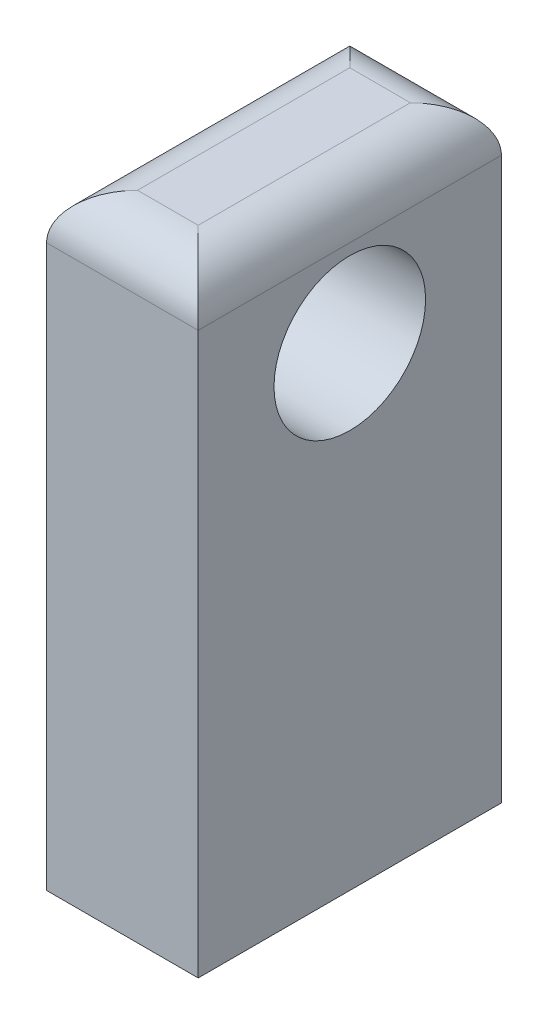
ISO-10303-21;
HEADER;
FILE_DESCRIPTION(('STEP AP214'),'2;1');
FILE_NAME('part.step','',(''),(''),'','','');
FILE_SCHEMA(('AUTOMOTIVE_DESIGN { 1 0 10303 214 1 1 1 1 }'));
ENDSEC;
DATA;
#1=APPLICATION_CONTEXT('core data for automotive mechanical design processes');
#2=APPLICATION_PROTOCOL_DEFINITION('international standard','automotive_design',2000,#1);
#3=PRODUCT_CONTEXT('',#1,'mechanical');
#4=PRODUCT('Part','Part','',(#3));
#5=PRODUCT_RELATED_PRODUCT_CATEGORY('part','',(#4));
#6=PRODUCT_DEFINITION_FORMATION('','',#4);
#7=PRODUCT_DEFINITION_CONTEXT('part definition',#1,'design');
#8=PRODUCT_DEFINITION('design','',#6,#7);
#9=PRODUCT_DEFINITION_SHAPE('','',#8);
#10=(LENGTH_UNIT() NAMED_UNIT(*) SI_UNIT(.MILLI.,.METRE.));
#11=(NAMED_UNIT(*) PLANE_ANGLE_UNIT() SI_UNIT($,.RADIAN.));
#12=(NAMED_UNIT(*) SI_UNIT($,.STERADIAN.) SOLID_ANGLE_UNIT());
#13=UNCERTAINTY_MEASURE_WITH_UNIT(LENGTH_MEASURE(1.E-05),#10,'distance_accuracy_value','');
#14=(GEOMETRIC_REPRESENTATION_CONTEXT(3) GLOBAL_UNCERTAINTY_ASSIGNED_CONTEXT((#13)) GLOBAL_UNIT_ASSIGNED_CONTEXT((#10,
#11,#12)) REPRESENTATION_CONTEXT('',''));
#15=CARTESIAN_POINT('',(0.,0.,0.));
#16=DIRECTION('',(0.,0.,1.));
#17=DIRECTION('',(1.,0.,0.));
#18=AXIS2_PLACEMENT_3D('',#15,#16,#17);
#19=CARTESIAN_POINT('',(10.,0.,-10.));
#20=DIRECTION('',(0.,0.,-1.));
#21=DIRECTION('',(0.,1.,0.));
#22=AXIS2_PLACEMENT_3D('',#19,#20,#21);
#23=PLANE('',#22);
#24=DIRECTION('',(0.,-1.,0.));
#25=VECTOR('',#24,1.);
#26=CARTESIAN_POINT('',(0.,0.,-10.));
#27=LINE('',#26,#25);
#28=CARTESIAN_POINT('',(0.,17.,-10.));
#29=VERTEX_POINT('',#28);
#30=CARTESIAN_POINT('',(0.,-20.,-10.));
#31=VERTEX_POINT('',#30);
#32=EDGE_CURVE('E144',#29,#31,#27,.T.);
#33=ORIENTED_EDGE('',*,*,#32,.F.);
#34=DIRECTION('',(-1.,0.,0.));
#35=VECTOR('',#34,1.);
#36=CARTESIAN_POINT('',(10.,17.,-10.));
#37=LINE('',#36,#35);
#38=CARTESIAN_POINT('',(10.,17.,-10.));
#39=VERTEX_POINT('',#38);
#40=EDGE_CURVE('E173',#29,#39,#37,.F.);
#41=ORIENTED_EDGE('',*,*,#40,.T.);
#42=DIRECTION('',(0.,-1.,0.));
#43=VECTOR('',#42,1.);
#44=CARTESIAN_POINT('',(10.,0.,-10.));
#45=LINE('',#44,#43);
#46=CARTESIAN_POINT('',(10.,-20.,-10.));
#47=VERTEX_POINT('',#46);
#48=EDGE_CURVE('E128',#39,#47,#45,.T.);
#49=ORIENTED_EDGE('',*,*,#48,.T.);
#50=DIRECTION('',(-1.,0.,0.));
#51=VECTOR('',#50,1.);
#52=CARTESIAN_POINT('',(10.,-20.,-10.));
#53=LINE('',#52,#51);
#54=EDGE_CURVE('E139',#47,#31,#53,.T.);
#55=ORIENTED_EDGE('',*,*,#54,.T.);
#56=EDGE_LOOP('',(#33,#41,#49,#55));
#57=FACE_BOUND('',#56,.T.);
#58=ADVANCED_FACE('F47',(#57),#23,.T.);
#59=CARTESIAN_POINT('',(10.,20.,0.));
#60=DIRECTION('',(0.,1.,0.));
#61=DIRECTION('',(0.,0.,1.));
#62=AXIS2_PLACEMENT_3D('',#59,#60,#61);
#63=PLANE('',#62);
#64=DIRECTION('',(0.,0.,-1.));
#65=VECTOR('',#64,1.);
#66=CARTESIAN_POINT('',(7.,20.,0.));
#67=LINE('',#66,#65);
#68=CARTESIAN_POINT('',(7.,20.,6.99999999999999));
#69=VERTEX_POINT('',#68);
#70=CARTESIAN_POINT('',(7.,20.,-7.));
#71=VERTEX_POINT('',#70);
#72=EDGE_CURVE('E166',#69,#71,#67,.T.);
#73=ORIENTED_EDGE('',*,*,#72,.T.);
#74=DIRECTION('',(-1.,0.,0.));
#75=VECTOR('',#74,1.);
#76=CARTESIAN_POINT('',(10.,20.,-7.));
#77=LINE('',#76,#75);
#78=CARTESIAN_POINT('',(3.,20.,-7.));
#79=VERTEX_POINT('',#78);
#80=EDGE_CURVE('E169',#71,#79,#77,.T.);
#81=ORIENTED_EDGE('',*,*,#80,.T.);
#82=DIRECTION('',(0.,0.,-1.));
#83=VECTOR('',#82,1.);
#84=CARTESIAN_POINT('',(3.,20.,9.99999999999999));
#85=LINE('',#84,#83);
#86=CARTESIAN_POINT('',(3.,20.,6.99999999999999));
#87=VERTEX_POINT('',#86);
#88=EDGE_CURVE('E160',#79,#87,#85,.F.);
#89=ORIENTED_EDGE('',*,*,#88,.T.);
#90=DIRECTION('',(-1.,0.,0.));
#91=VECTOR('',#90,1.);
#92=CARTESIAN_POINT('',(10.,20.,6.99999999999999));
#93=LINE('',#92,#91);
#94=EDGE_CURVE('E163',#87,#69,#93,.F.);
#95=ORIENTED_EDGE('',*,*,#94,.T.);
#96=EDGE_LOOP('',(#73,#81,#89,#95));
#97=FACE_BOUND('',#96,.T.);
#98=ADVANCED_FACE('F210',(#97),#63,.T.);
#99=CARTESIAN_POINT('',(10.,0.,9.99999999999999));
#100=DIRECTION('',(0.,0.,-1.));
#101=DIRECTION('',(0.,1.,0.));
#102=AXIS2_PLACEMENT_3D('',#99,#100,#101);
#103=PLANE('',#102);
#104=DIRECTION('',(0.,-1.,0.));
#105=VECTOR('',#104,1.);
#106=CARTESIAN_POINT('',(10.,0.,9.99999999999999));
#107=LINE('',#106,#105);
#108=CARTESIAN_POINT('',(10.,17.,9.99999999999999));
#109=VERTEX_POINT('',#108);
#110=CARTESIAN_POINT('',(10.,-20.,9.99999999999999));
#111=VERTEX_POINT('',#110);
#112=EDGE_CURVE('E132',#109,#111,#107,.T.);
#113=ORIENTED_EDGE('',*,*,#112,.F.);
#114=DIRECTION('',(-1.,0.,0.));
#115=VECTOR('',#114,1.);
#116=CARTESIAN_POINT('',(0.,17.,9.99999999999999));
#117=LINE('',#116,#115);
#118=CARTESIAN_POINT('',(0.,17.,9.99999999999999));
#119=VERTEX_POINT('',#118);
#120=EDGE_CURVE('E57',#109,#119,#117,.T.);
#121=ORIENTED_EDGE('',*,*,#120,.T.);
#122=DIRECTION('',(0.,-1.,0.));
#123=VECTOR('',#122,1.);
#124=CARTESIAN_POINT('',(0.,0.,9.99999999999999));
#125=LINE('',#124,#123);
#126=CARTESIAN_POINT('',(0.,-20.,9.99999999999999));
#127=VERTEX_POINT('',#126);
#128=EDGE_CURVE('E147',#119,#127,#125,.T.);
#129=ORIENTED_EDGE('',*,*,#128,.T.);
#130=DIRECTION('',(-1.,0.,0.));
#131=VECTOR('',#130,1.);
#132=CARTESIAN_POINT('',(10.,-20.,9.99999999999999));
#133=LINE('',#132,#131);
#134=EDGE_CURVE('E156',#111,#127,#133,.T.);
#135=ORIENTED_EDGE('',*,*,#134,.F.);
#136=EDGE_LOOP('',(#113,#121,#129,#135));
#137=FACE_BOUND('',#136,.T.);
#138=ADVANCED_FACE('F212',(#137),#103,.F.);
#139=CARTESIAN_POINT('',(10.,11.27,0.));
#140=DIRECTION('',(-1.,0.,0.));
#141=DIRECTION('',(0.,0.,1.));
#142=AXIS2_PLACEMENT_3D('',#139,#140,#141);
#143=CYLINDRICAL_SURFACE('',#142,5.);
#144=CARTESIAN_POINT('',(10.,11.27,0.));
#145=DIRECTION('',(1.,0.,0.));
#146=DIRECTION('',(0.,0.,-1.));
#147=AXIS2_PLACEMENT_3D('',#144,#145,#146);
#148=CIRCLE('',#147,5.);
#149=CARTESIAN_POINT('',(10.,11.27,-5.00000000000001));
#150=VERTEX_POINT('',#149);
#151=EDGE_CURVE('E124',#150,#150,#148,.T.);
#152=ORIENTED_EDGE('',*,*,#151,.T.);
#153=EDGE_LOOP('',(#152));
#154=FACE_BOUND('',#153,.T.);
#155=CARTESIAN_POINT('',(0.,11.27,0.));
#156=DIRECTION('',(1.,0.,0.));
#157=DIRECTION('',(0.,0.,-1.));
#158=AXIS2_PLACEMENT_3D('',#155,#156,#157);
#159=CIRCLE('',#158,5.);
#160=CARTESIAN_POINT('',(0.,11.27,-5.00000000000001));
#161=VERTEX_POINT('',#160);
#162=EDGE_CURVE('E140',#161,#161,#159,.T.);
#163=ORIENTED_EDGE('',*,*,#162,.F.);
#164=EDGE_LOOP('',(#163));
#165=FACE_BOUND('',#164,.T.);
#166=ADVANCED_FACE('F218',(#154,#165),#143,.F.);
#167=CARTESIAN_POINT('',(10.,-20.,0.));
#168=DIRECTION('',(0.,1.,0.));
#169=DIRECTION('',(0.,0.,1.));
#170=AXIS2_PLACEMENT_3D('',#167,#168,#169);
#171=PLANE('',#170);
#172=CARTESIAN_POINT('',(5.,-20.,0.));
#173=DIRECTION('',(0.,-1.,0.));
#174=DIRECTION('',(0.,0.,-1.));
#175=AXIS2_PLACEMENT_3D('',#172,#173,#174);
#176=CIRCLE('',#175,1.49999999999999);
#177=CARTESIAN_POINT('',(5.,-20.,-1.49999999999999));
#178=VERTEX_POINT('',#177);
#179=EDGE_CURVE('E115',#178,#178,#176,.T.);
#180=ORIENTED_EDGE('',*,*,#179,.F.);
#181=EDGE_LOOP('',(#180));
#182=FACE_BOUND('',#181,.T.);
#183=DIRECTION('',(0.,0.,-1.));
#184=VECTOR('',#183,1.);
#185=CARTESIAN_POINT('',(0.,-20.,0.));
#186=LINE('',#185,#184);
#187=EDGE_CURVE('E129',#127,#31,#186,.T.);
#188=ORIENTED_EDGE('',*,*,#187,.T.);
#189=ORIENTED_EDGE('',*,*,#54,.F.);
#190=DIRECTION('',(0.,0.,-1.));
#191=VECTOR('',#190,1.);
#192=CARTESIAN_POINT('',(10.,-20.,0.));
#193=LINE('',#192,#191);
#194=EDGE_CURVE('E135',#111,#47,#193,.T.);
#195=ORIENTED_EDGE('',*,*,#194,.F.);
#196=ORIENTED_EDGE('',*,*,#134,.T.);
#197=EDGE_LOOP('',(#188,#189,#195,#196));
#198=FACE_BOUND('',#197,.T.);
#199=ADVANCED_FACE('F225',(#182,#198),#171,.F.);
#200=CARTESIAN_POINT('',(10.,0.,0.));
#201=DIRECTION('',(1.,0.,0.));
#202=DIRECTION('',(0.,0.,-1.));
#203=AXIS2_PLACEMENT_3D('',#200,#201,#202);
#204=PLANE('',#203);
#205=ORIENTED_EDGE('',*,*,#151,.F.);
#206=EDGE_LOOP('',(#205));
#207=FACE_BOUND('',#206,.T.);
#208=ORIENTED_EDGE('',*,*,#48,.F.);
#209=DIRECTION('',(0.,0.,-1.));
#210=VECTOR('',#209,1.);
#211=CARTESIAN_POINT('',(10.,17.,0.));
#212=LINE('',#211,#210);
#213=EDGE_CURVE('E72',#39,#109,#212,.F.);
#214=ORIENTED_EDGE('',*,*,#213,.T.);
#215=ORIENTED_EDGE('',*,*,#112,.T.);
#216=ORIENTED_EDGE('',*,*,#194,.T.);
#217=EDGE_LOOP('',(#208,#214,#215,#216));
#218=FACE_BOUND('',#217,.T.);
#219=ADVANCED_FACE('F237',(#207,#218),#204,.T.);
#220=CARTESIAN_POINT('',(0.,0.,0.));
#221=DIRECTION('',(1.,0.,0.));
#222=DIRECTION('',(0.,0.,-1.));
#223=AXIS2_PLACEMENT_3D('',#220,#221,#222);
#224=PLANE('',#223);
#225=ORIENTED_EDGE('',*,*,#162,.T.);
#226=EDGE_LOOP('',(#225));
#227=FACE_BOUND('',#226,.T.);
#228=ORIENTED_EDGE('',*,*,#128,.F.);
#229=DIRECTION('',(0.,0.,-1.));
#230=VECTOR('',#229,1.);
#231=CARTESIAN_POINT('',(0.,17.,-10.));
#232=LINE('',#231,#230);
#233=EDGE_CURVE('E11',#119,#29,#232,.T.);
#234=ORIENTED_EDGE('',*,*,#233,.T.);
#235=ORIENTED_EDGE('',*,*,#32,.T.);
#236=ORIENTED_EDGE('',*,*,#187,.F.);
#237=EDGE_LOOP('',(#228,#234,#235,#236));
#238=FACE_BOUND('',#237,.T.);
#239=ADVANCED_FACE('F202',(#227,#238),#224,.F.);
#240=CARTESIAN_POINT('',(10.,17.,6.99999999999999));
#241=DIRECTION('',(1.,0.,0.));
#242=DIRECTION('',(0.,0.,-1.));
#243=AXIS2_PLACEMENT_3D('',#240,#241,#242);
#244=CYLINDRICAL_SURFACE('',#243,3.);
#245=CARTESIAN_POINT('',(3.,17.,6.99999999999999));
#246=DIRECTION('',(0.707106781186547,0.,0.707106781186547));
#247=DIRECTION('',(-0.707106781186547,0.,0.707106781186547));
#248=AXIS2_PLACEMENT_3D('',#245,#246,#247);
#249=ELLIPSE('',#248,4.24264068711928,3.);
#250=EDGE_CURVE('E182',#119,#87,#249,.F.);
#251=ORIENTED_EDGE('',*,*,#250,.F.);
#252=ORIENTED_EDGE('',*,*,#120,.F.);
#253=CARTESIAN_POINT('',(7.,17.,6.99999999999999));
#254=DIRECTION('',(0.707106781186547,0.,-0.707106781186547));
#255=DIRECTION('',(0.707106781186547,0.,0.707106781186547));
#256=AXIS2_PLACEMENT_3D('',#253,#254,#255);
#257=ELLIPSE('',#256,4.24264068711928,3.);
#258=EDGE_CURVE('E51',#69,#109,#257,.T.);
#259=ORIENTED_EDGE('',*,*,#258,.F.);
#260=ORIENTED_EDGE('',*,*,#94,.F.);
#261=EDGE_LOOP('',(#251,#252,#259,#260));
#262=FACE_BOUND('',#261,.T.);
#263=ADVANCED_FACE('F49',(#262),#244,.T.);
#264=CARTESIAN_POINT('',(7.,17.,0.));
#265=DIRECTION('',(0.,0.,-1.));
#266=DIRECTION('',(-1.,0.,0.));
#267=AXIS2_PLACEMENT_3D('',#264,#265,#266);
#268=CYLINDRICAL_SURFACE('',#267,3.);
#269=ORIENTED_EDGE('',*,*,#258,.T.);
#270=ORIENTED_EDGE('',*,*,#213,.F.);
#271=CARTESIAN_POINT('',(7.,17.,-7.));
#272=DIRECTION('',(-0.707106781186547,0.,-0.707106781186547));
#273=DIRECTION('',(0.707106781186547,0.,-0.707106781186547));
#274=AXIS2_PLACEMENT_3D('',#271,#272,#273);
#275=ELLIPSE('',#274,4.24264068711928,3.);
#276=EDGE_CURVE('E119',#71,#39,#275,.T.);
#277=ORIENTED_EDGE('',*,*,#276,.F.);
#278=ORIENTED_EDGE('',*,*,#72,.F.);
#279=EDGE_LOOP('',(#269,#270,#277,#278));
#280=FACE_BOUND('',#279,.T.);
#281=ADVANCED_FACE('F194',(#280),#268,.T.);
#282=CARTESIAN_POINT('',(3.,17.,0.));
#283=DIRECTION('',(0.,0.,1.));
#284=DIRECTION('',(1.,0.,0.));
#285=AXIS2_PLACEMENT_3D('',#282,#283,#284);
#286=CYLINDRICAL_SURFACE('',#285,3.);
#287=ORIENTED_EDGE('',*,*,#250,.T.);
#288=ORIENTED_EDGE('',*,*,#88,.F.);
#289=CARTESIAN_POINT('',(3.,17.,-7.));
#290=DIRECTION('',(-0.707106781186547,0.,0.707106781186547));
#291=DIRECTION('',(0.707106781186547,0.,0.707106781186547));
#292=AXIS2_PLACEMENT_3D('',#289,#290,#291);
#293=ELLIPSE('',#292,4.24264068711928,3.);
#294=EDGE_CURVE('E114',#29,#79,#293,.F.);
#295=ORIENTED_EDGE('',*,*,#294,.F.);
#296=ORIENTED_EDGE('',*,*,#233,.F.);
#297=EDGE_LOOP('',(#287,#288,#295,#296));
#298=FACE_BOUND('',#297,.T.);
#299=ADVANCED_FACE('F199',(#298),#286,.T.);
#300=CARTESIAN_POINT('',(10.,17.,-7.));
#301=DIRECTION('',(-1.,0.,0.));
#302=DIRECTION('',(0.,0.,1.));
#303=AXIS2_PLACEMENT_3D('',#300,#301,#302);
#304=CYLINDRICAL_SURFACE('',#303,3.);
#305=ORIENTED_EDGE('',*,*,#276,.T.);
#306=ORIENTED_EDGE('',*,*,#40,.F.);
#307=ORIENTED_EDGE('',*,*,#294,.T.);
#308=ORIENTED_EDGE('',*,*,#80,.F.);
#309=EDGE_LOOP('',(#305,#306,#307,#308));
#310=FACE_BOUND('',#309,.T.);
#311=ADVANCED_FACE('F107',(#310),#304,.T.);
#312=CARTESIAN_POINT('',(5.,-15.,0.));
#313=DIRECTION('',(0.,-1.,0.));
#314=DIRECTION('',(0.,0.,-1.));
#315=AXIS2_PLACEMENT_3D('',#312,#313,#314);
#316=CONICAL_SURFACE('',#315,1.5,1.02974425867665);
#317=CARTESIAN_POINT('',(5.,-14.0987090714587,0.));
#318=VERTEX_POINT('',#317);
#319=VERTEX_LOOP('',#318);
#320=FACE_BOUND('',#319,.T.);
#321=CARTESIAN_POINT('',(5.,-15.,0.));
#322=DIRECTION('',(0.,-1.,0.));
#323=DIRECTION('',(0.,0.,-1.));
#324=AXIS2_PLACEMENT_3D('',#321,#322,#323);
#325=CIRCLE('',#324,1.5);
#326=CARTESIAN_POINT('',(5.,-15.,-1.5));
#327=VERTEX_POINT('',#326);
#328=EDGE_CURVE('E111',#327,#327,#325,.T.);
#329=ORIENTED_EDGE('',*,*,#328,.T.);
#330=EDGE_LOOP('',(#329));
#331=FACE_BOUND('',#330,.T.);
#332=ADVANCED_FACE('F103',(#320,#331),#316,.F.);
#333=CARTESIAN_POINT('',(5.,-20.,0.));
#334=DIRECTION('',(0.,-1.,0.));
#335=DIRECTION('',(0.,0.,-1.));
#336=AXIS2_PLACEMENT_3D('',#333,#334,#335);
#337=CYLINDRICAL_SURFACE('',#336,1.49999999999999);
#338=ORIENTED_EDGE('',*,*,#328,.F.);
#339=EDGE_LOOP('',(#338));
#340=FACE_BOUND('',#339,.T.);
#341=ORIENTED_EDGE('',*,*,#179,.T.);
#342=EDGE_LOOP('',(#341));
#343=FACE_BOUND('',#342,.T.);
#344=ADVANCED_FACE('F106',(#340,#343),#337,.F.);
#345=CLOSED_SHELL('',(#58,#98,#138,#166,#199,#219,#239,#263,#281,#299,#311,#332,#344));
#346=MANIFOLD_SOLID_BREP('B2',#345);
#347=ADVANCED_BREP_SHAPE_REPRESENTATION('',(#18,#346),#14);
#348=SHAPE_DEFINITION_REPRESENTATION(#9,#347);
ENDSEC;
END-ISO-10303-21;
